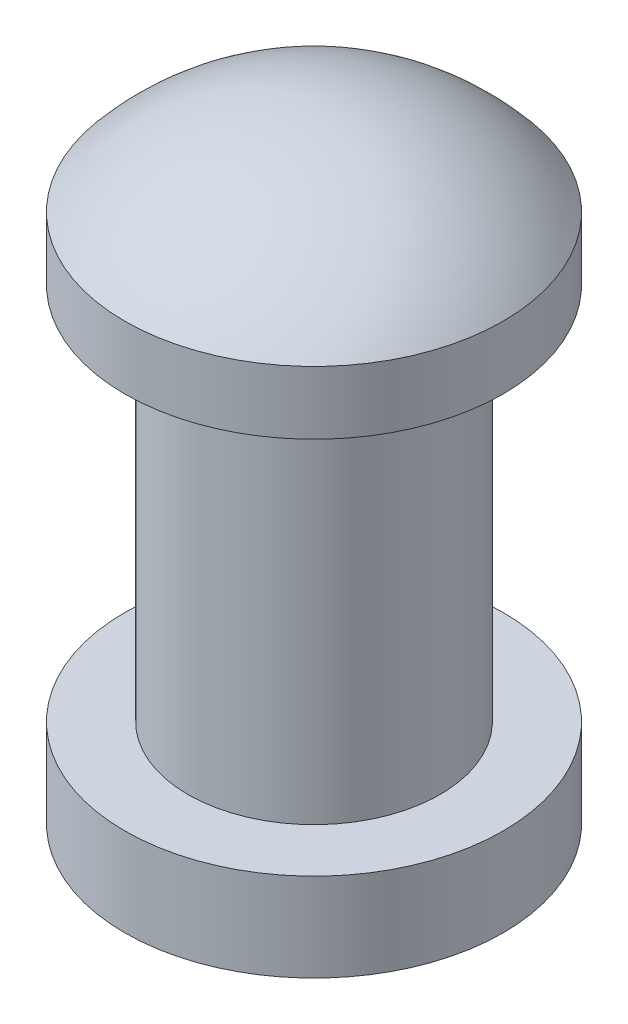
ISO-10303-21;
HEADER;
FILE_DESCRIPTION(('STEP AP214'),'2;1');
FILE_NAME('part.step','',(''),(''),'','','');
FILE_SCHEMA(('AUTOMOTIVE_DESIGN { 1 0 10303 214 1 1 1 1 }'));
ENDSEC;
DATA;
#1=APPLICATION_CONTEXT('core data for automotive mechanical design processes');
#2=APPLICATION_PROTOCOL_DEFINITION('international standard','automotive_design',2000,#1);
#3=PRODUCT_CONTEXT('',#1,'mechanical');
#4=PRODUCT('Part','Part','',(#3));
#5=PRODUCT_RELATED_PRODUCT_CATEGORY('part','',(#4));
#6=PRODUCT_DEFINITION_FORMATION('','',#4);
#7=PRODUCT_DEFINITION_CONTEXT('part definition',#1,'design');
#8=PRODUCT_DEFINITION('design','',#6,#7);
#9=PRODUCT_DEFINITION_SHAPE('','',#8);
#10=(LENGTH_UNIT() NAMED_UNIT(*) SI_UNIT(.MILLI.,.METRE.));
#11=(NAMED_UNIT(*) PLANE_ANGLE_UNIT() SI_UNIT($,.RADIAN.));
#12=(NAMED_UNIT(*) SI_UNIT($,.STERADIAN.) SOLID_ANGLE_UNIT());
#13=UNCERTAINTY_MEASURE_WITH_UNIT(LENGTH_MEASURE(1.E-05),#10,'distance_accuracy_value','');
#14=(GEOMETRIC_REPRESENTATION_CONTEXT(3) GLOBAL_UNCERTAINTY_ASSIGNED_CONTEXT((#13)) GLOBAL_UNIT_ASSIGNED_CONTEXT((#10,
#11,#12)) REPRESENTATION_CONTEXT('',''));
#15=CARTESIAN_POINT('',(0.,0.,0.));
#16=DIRECTION('',(0.,0.,1.));
#17=DIRECTION('',(1.,0.,0.));
#18=AXIS2_PLACEMENT_3D('',#15,#16,#17);
#19=CARTESIAN_POINT('',(0.,1.02142857142857,0.));
#20=DIRECTION('',(0.,1.,0.));
#21=DIRECTION('',(1.,0.,0.));
#22=AXIS2_PLACEMENT_3D('',#19,#20,#21);
#23=SPHERICAL_SURFACE('',#22,0.978571428571428);
#24=CARTESIAN_POINT('',(0.,1.65,0.));
#25=DIRECTION('',(0.,1.,0.));
#26=DIRECTION('',(0.,0.,1.));
#27=AXIS2_PLACEMENT_3D('',#24,#25,#26);
#28=CIRCLE('',#27,0.75);
#29=CARTESIAN_POINT('',(0.,1.65,0.75));
#30=VERTEX_POINT('',#29);
#31=EDGE_CURVE('E10',#30,#30,#28,.T.);
#32=ORIENTED_EDGE('',*,*,#31,.T.);
#33=EDGE_LOOP('',(#32));
#34=FACE_BOUND('',#33,.T.);
#35=ADVANCED_FACE('F30',(#34),#23,.T.);
#36=CARTESIAN_POINT('',(0.,2.,0.));
#37=DIRECTION('',(0.,1.,0.));
#38=DIRECTION('',(0.,0.,1.));
#39=AXIS2_PLACEMENT_3D('',#36,#37,#38);
#40=CYLINDRICAL_SURFACE('',#39,0.75);
#41=ORIENTED_EDGE('',*,*,#31,.F.);
#42=EDGE_LOOP('',(#41));
#43=FACE_BOUND('',#42,.T.);
#44=CARTESIAN_POINT('',(0.,1.4,0.));
#45=DIRECTION('',(0.,1.,0.));
#46=DIRECTION('',(0.,0.,1.));
#47=AXIS2_PLACEMENT_3D('',#44,#45,#46);
#48=CIRCLE('',#47,0.75);
#49=CARTESIAN_POINT('',(0.,1.4,0.75));
#50=VERTEX_POINT('',#49);
#51=EDGE_CURVE('E36',#50,#50,#48,.T.);
#52=ORIENTED_EDGE('',*,*,#51,.T.);
#53=EDGE_LOOP('',(#52));
#54=FACE_BOUND('',#53,.T.);
#55=ADVANCED_FACE('F68',(#43,#54),#40,.T.);
#56=CARTESIAN_POINT('',(0.75,1.4,0.));
#57=DIRECTION('',(0.,1.,0.));
#58=DIRECTION('',(0.,0.,1.));
#59=AXIS2_PLACEMENT_3D('',#56,#57,#58);
#60=PLANE('',#59);
#61=ORIENTED_EDGE('',*,*,#51,.F.);
#62=EDGE_LOOP('',(#61));
#63=FACE_BOUND('',#62,.T.);
#64=CARTESIAN_POINT('',(0.,1.4,0.));
#65=DIRECTION('',(0.,1.,0.));
#66=DIRECTION('',(0.,0.,1.));
#67=AXIS2_PLACEMENT_3D('',#64,#65,#66);
#68=CIRCLE('',#67,0.499999999999999);
#69=CARTESIAN_POINT('',(0.,1.4,0.499999999999999));
#70=VERTEX_POINT('',#69);
#71=EDGE_CURVE('E40',#70,#70,#68,.T.);
#72=ORIENTED_EDGE('',*,*,#71,.T.);
#73=EDGE_LOOP('',(#72));
#74=FACE_BOUND('',#73,.T.);
#75=ADVANCED_FACE('F72',(#63,#74),#60,.F.);
#76=CARTESIAN_POINT('',(0.,2.,0.));
#77=DIRECTION('',(0.,1.,0.));
#78=DIRECTION('',(0.,0.,1.));
#79=AXIS2_PLACEMENT_3D('',#76,#77,#78);
#80=CYLINDRICAL_SURFACE('',#79,0.5);
#81=ORIENTED_EDGE('',*,*,#71,.F.);
#82=EDGE_LOOP('',(#81));
#83=FACE_BOUND('',#82,.T.);
#84=CARTESIAN_POINT('',(0.,-0.1,0.));
#85=DIRECTION('',(0.,1.,0.));
#86=DIRECTION('',(0.,0.,1.));
#87=AXIS2_PLACEMENT_3D('',#84,#85,#86);
#88=CIRCLE('',#87,0.5);
#89=CARTESIAN_POINT('',(0.,-0.1,0.5));
#90=VERTEX_POINT('',#89);
#91=EDGE_CURVE('E44',#90,#90,#88,.T.);
#92=ORIENTED_EDGE('',*,*,#91,.T.);
#93=EDGE_LOOP('',(#92));
#94=FACE_BOUND('',#93,.T.);
#95=ADVANCED_FACE('F77',(#83,#94),#80,.T.);
#96=CARTESIAN_POINT('',(0.5,-0.1,0.));
#97=DIRECTION('',(0.,-1.,0.));
#98=DIRECTION('',(0.,0.,-1.));
#99=AXIS2_PLACEMENT_3D('',#96,#97,#98);
#100=PLANE('',#99);
#101=ORIENTED_EDGE('',*,*,#91,.F.);
#102=EDGE_LOOP('',(#101));
#103=FACE_BOUND('',#102,.T.);
#104=CARTESIAN_POINT('',(0.,-0.1,0.));
#105=DIRECTION('',(0.,1.,0.));
#106=DIRECTION('',(0.,0.,1.));
#107=AXIS2_PLACEMENT_3D('',#104,#105,#106);
#108=CIRCLE('',#107,0.75);
#109=CARTESIAN_POINT('',(0.,-0.1,0.75));
#110=VERTEX_POINT('',#109);
#111=EDGE_CURVE('E49',#110,#110,#108,.T.);
#112=ORIENTED_EDGE('',*,*,#111,.T.);
#113=EDGE_LOOP('',(#112));
#114=FACE_BOUND('',#113,.T.);
#115=ADVANCED_FACE('F64',(#103,#114),#100,.F.);
#116=CARTESIAN_POINT('',(0.,2.,0.));
#117=DIRECTION('',(0.,1.,0.));
#118=DIRECTION('',(0.,0.,1.));
#119=AXIS2_PLACEMENT_3D('',#116,#117,#118);
#120=CYLINDRICAL_SURFACE('',#119,0.75);
#121=ORIENTED_EDGE('',*,*,#111,.F.);
#122=EDGE_LOOP('',(#121));
#123=FACE_BOUND('',#122,.T.);
#124=CARTESIAN_POINT('',(0.,-0.45,0.));
#125=DIRECTION('',(0.,1.,0.));
#126=DIRECTION('',(0.,0.,1.));
#127=AXIS2_PLACEMENT_3D('',#124,#125,#126);
#128=CIRCLE('',#127,0.75);
#129=CARTESIAN_POINT('',(0.,-0.45,0.75));
#130=VERTEX_POINT('',#129);
#131=EDGE_CURVE('E52',#130,#130,#128,.T.);
#132=ORIENTED_EDGE('',*,*,#131,.T.);
#133=EDGE_LOOP('',(#132));
#134=FACE_BOUND('',#133,.T.);
#135=ADVANCED_FACE('F56',(#123,#134),#120,.T.);
#136=CARTESIAN_POINT('',(0.75,-0.45,0.));
#137=DIRECTION('',(0.,1.,0.));
#138=DIRECTION('',(0.,0.,1.));
#139=AXIS2_PLACEMENT_3D('',#136,#137,#138);
#140=PLANE('',#139);
#141=ORIENTED_EDGE('',*,*,#131,.F.);
#142=EDGE_LOOP('',(#141));
#143=FACE_BOUND('',#142,.T.);
#144=ADVANCED_FACE('F58',(#143),#140,.F.);
#145=CLOSED_SHELL('',(#35,#55,#75,#95,#115,#135,#144));
#146=MANIFOLD_SOLID_BREP('B2',#145);
#147=ADVANCED_BREP_SHAPE_REPRESENTATION('',(#18,#146),#14);
#148=SHAPE_DEFINITION_REPRESENTATION(#9,#147);
ENDSEC;
END-ISO-10303-21;
